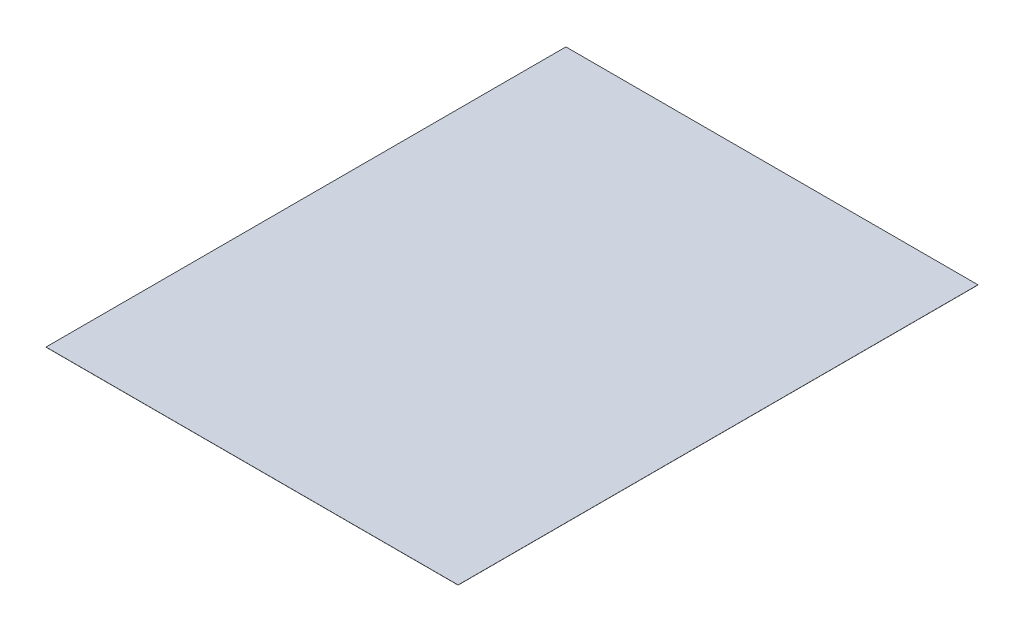
ISO-10303-21;
HEADER;
FILE_DESCRIPTION(('STEP AP214'),'2;1');
FILE_NAME('part.step','',(''),(''),'','','');
FILE_SCHEMA(('AUTOMOTIVE_DESIGN { 1 0 10303 214 1 1 1 1 }'));
ENDSEC;
DATA;
#1=APPLICATION_CONTEXT('core data for automotive mechanical design processes');
#2=APPLICATION_PROTOCOL_DEFINITION('international standard','automotive_design',2000,#1);
#3=PRODUCT_CONTEXT('',#1,'mechanical');
#4=PRODUCT('Part','Part','',(#3));
#5=PRODUCT_RELATED_PRODUCT_CATEGORY('part','',(#4));
#6=PRODUCT_DEFINITION_FORMATION('','',#4);
#7=PRODUCT_DEFINITION_CONTEXT('part definition',#1,'design');
#8=PRODUCT_DEFINITION('design','',#6,#7);
#9=PRODUCT_DEFINITION_SHAPE('','',#8);
#10=(LENGTH_UNIT() NAMED_UNIT(*) SI_UNIT(.MILLI.,.METRE.));
#11=(NAMED_UNIT(*) PLANE_ANGLE_UNIT() SI_UNIT($,.RADIAN.));
#12=(NAMED_UNIT(*) SI_UNIT($,.STERADIAN.) SOLID_ANGLE_UNIT());
#13=UNCERTAINTY_MEASURE_WITH_UNIT(LENGTH_MEASURE(1.E-05),#10,'distance_accuracy_value','');
#14=(GEOMETRIC_REPRESENTATION_CONTEXT(3) GLOBAL_UNCERTAINTY_ASSIGNED_CONTEXT((#13)) GLOBAL_UNIT_ASSIGNED_CONTEXT((#10,
#11,#12)) REPRESENTATION_CONTEXT('',''));
#15=CARTESIAN_POINT('',(0.,0.,0.));
#16=DIRECTION('',(0.,0.,1.));
#17=DIRECTION('',(1.,0.,0.));
#18=AXIS2_PLACEMENT_3D('',#15,#16,#17);
#19=CARTESIAN_POINT('',(0.,0.02,0.));
#20=DIRECTION('',(0.,1.,0.));
#21=DIRECTION('',(0.,0.,1.));
#22=AXIS2_PLACEMENT_3D('',#19,#20,#21);
#23=PLANE('',#22);
#24=DIRECTION('',(-1.,0.,0.));
#25=VECTOR('',#24,1.);
#26=CARTESIAN_POINT('',(32.5,0.02,-41.));
#27=LINE('',#26,#25);
#28=CARTESIAN_POINT('',(-32.5,0.02,-41.));
#29=VERTEX_POINT('',#28);
#30=CARTESIAN_POINT('',(32.5,0.02,-41.));
#31=VERTEX_POINT('',#30);
#32=EDGE_CURVE('E68',#29,#31,#27,.F.);
#33=ORIENTED_EDGE('',*,*,#32,.F.);
#34=DIRECTION('',(0.,0.,1.));
#35=VECTOR('',#34,1.);
#36=CARTESIAN_POINT('',(-32.5,0.02,-41.));
#37=LINE('',#36,#35);
#38=CARTESIAN_POINT('',(-32.5,0.02,41.));
#39=VERTEX_POINT('',#38);
#40=EDGE_CURVE('E20',#39,#29,#37,.F.);
#41=ORIENTED_EDGE('',*,*,#40,.F.);
#42=DIRECTION('',(1.,0.,0.));
#43=VECTOR('',#42,1.);
#44=CARTESIAN_POINT('',(-32.5,0.02,41.));
#45=LINE('',#44,#43);
#46=CARTESIAN_POINT('',(32.5,0.02,41.));
#47=VERTEX_POINT('',#46);
#48=EDGE_CURVE('E58',#47,#39,#45,.F.);
#49=ORIENTED_EDGE('',*,*,#48,.F.);
#50=DIRECTION('',(0.,0.,-1.));
#51=VECTOR('',#50,1.);
#52=CARTESIAN_POINT('',(32.5,0.02,41.));
#53=LINE('',#52,#51);
#54=EDGE_CURVE('E53',#31,#47,#53,.F.);
#55=ORIENTED_EDGE('',*,*,#54,.F.);
#56=EDGE_LOOP('',(#33,#41,#49,#55));
#57=FACE_BOUND('',#56,.T.);
#58=ADVANCED_FACE('F17',(#57),#23,.T.);
#59=CARTESIAN_POINT('',(-32.5,0.,-41.));
#60=DIRECTION('',(-1.,0.,0.));
#61=DIRECTION('',(0.,0.,1.));
#62=AXIS2_PLACEMENT_3D('',#59,#60,#61);
#63=PLANE('',#62);
#64=DIRECTION('',(0.,1.,0.));
#65=VECTOR('',#64,1.);
#66=CARTESIAN_POINT('',(-32.5,0.,-41.));
#67=LINE('',#66,#65);
#68=CARTESIAN_POINT('',(-32.5,0.,-41.));
#69=VERTEX_POINT('',#68);
#70=EDGE_CURVE('E79',#69,#29,#67,.T.);
#71=ORIENTED_EDGE('',*,*,#70,.F.);
#72=DIRECTION('',(0.,0.,1.));
#73=VECTOR('',#72,1.);
#74=CARTESIAN_POINT('',(-32.5,0.,0.));
#75=LINE('',#74,#73);
#76=CARTESIAN_POINT('',(-32.5,0.,41.));
#77=VERTEX_POINT('',#76);
#78=EDGE_CURVE('E74',#69,#77,#75,.T.);
#79=ORIENTED_EDGE('',*,*,#78,.T.);
#80=DIRECTION('',(0.,1.,0.));
#81=VECTOR('',#80,1.);
#82=CARTESIAN_POINT('',(-32.5,0.,41.));
#83=LINE('',#82,#81);
#84=EDGE_CURVE('E63',#39,#77,#83,.F.);
#85=ORIENTED_EDGE('',*,*,#84,.F.);
#86=ORIENTED_EDGE('',*,*,#40,.T.);
#87=EDGE_LOOP('',(#71,#79,#85,#86));
#88=FACE_BOUND('',#87,.T.);
#89=ADVANCED_FACE('F73',(#88),#63,.T.);
#90=CARTESIAN_POINT('',(-32.5,0.,41.));
#91=DIRECTION('',(0.,0.,1.));
#92=DIRECTION('',(1.,0.,0.));
#93=AXIS2_PLACEMENT_3D('',#90,#91,#92);
#94=PLANE('',#93);
#95=ORIENTED_EDGE('',*,*,#84,.T.);
#96=DIRECTION('',(1.,0.,0.));
#97=VECTOR('',#96,1.);
#98=CARTESIAN_POINT('',(0.,0.,41.));
#99=LINE('',#98,#97);
#100=CARTESIAN_POINT('',(32.5,0.,41.));
#101=VERTEX_POINT('',#100);
#102=EDGE_CURVE('E84',#77,#101,#99,.T.);
#103=ORIENTED_EDGE('',*,*,#102,.T.);
#104=DIRECTION('',(0.,1.,0.));
#105=VECTOR('',#104,1.);
#106=CARTESIAN_POINT('',(32.5,0.,41.));
#107=LINE('',#106,#105);
#108=EDGE_CURVE('E65',#47,#101,#107,.F.);
#109=ORIENTED_EDGE('',*,*,#108,.F.);
#110=ORIENTED_EDGE('',*,*,#48,.T.);
#111=EDGE_LOOP('',(#95,#103,#109,#110));
#112=FACE_BOUND('',#111,.T.);
#113=ADVANCED_FACE('F60',(#112),#94,.T.);
#114=CARTESIAN_POINT('',(32.5,0.,41.));
#115=DIRECTION('',(1.,0.,0.));
#116=DIRECTION('',(0.,0.,-1.));
#117=AXIS2_PLACEMENT_3D('',#114,#115,#116);
#118=PLANE('',#117);
#119=ORIENTED_EDGE('',*,*,#108,.T.);
#120=DIRECTION('',(0.,0.,1.));
#121=VECTOR('',#120,1.);
#122=CARTESIAN_POINT('',(32.5,0.,0.));
#123=LINE('',#122,#121);
#124=CARTESIAN_POINT('',(32.5,0.,-41.));
#125=VERTEX_POINT('',#124);
#126=EDGE_CURVE('E26',#101,#125,#123,.F.);
#127=ORIENTED_EDGE('',*,*,#126,.T.);
#128=DIRECTION('',(0.,1.,0.));
#129=VECTOR('',#128,1.);
#130=CARTESIAN_POINT('',(32.5,0.,-41.));
#131=LINE('',#130,#129);
#132=EDGE_CURVE('E34',#31,#125,#131,.F.);
#133=ORIENTED_EDGE('',*,*,#132,.F.);
#134=ORIENTED_EDGE('',*,*,#54,.T.);
#135=EDGE_LOOP('',(#119,#127,#133,#134));
#136=FACE_BOUND('',#135,.T.);
#137=ADVANCED_FACE('F88',(#136),#118,.T.);
#138=CARTESIAN_POINT('',(32.5,0.,-41.));
#139=DIRECTION('',(0.,0.,-1.));
#140=DIRECTION('',(-1.,0.,0.));
#141=AXIS2_PLACEMENT_3D('',#138,#139,#140);
#142=PLANE('',#141);
#143=ORIENTED_EDGE('',*,*,#132,.T.);
#144=DIRECTION('',(1.,0.,0.));
#145=VECTOR('',#144,1.);
#146=CARTESIAN_POINT('',(0.,0.,-41.));
#147=LINE('',#146,#145);
#148=EDGE_CURVE('E11',#125,#69,#147,.F.);
#149=ORIENTED_EDGE('',*,*,#148,.T.);
#150=ORIENTED_EDGE('',*,*,#70,.T.);
#151=ORIENTED_EDGE('',*,*,#32,.T.);
#152=EDGE_LOOP('',(#143,#149,#150,#151));
#153=FACE_BOUND('',#152,.T.);
#154=ADVANCED_FACE('F91',(#153),#142,.T.);
#155=CARTESIAN_POINT('',(0.,0.,0.));
#156=DIRECTION('',(0.,1.,0.));
#157=DIRECTION('',(0.,0.,1.));
#158=AXIS2_PLACEMENT_3D('',#155,#156,#157);
#159=PLANE('',#158);
#160=ORIENTED_EDGE('',*,*,#126,.F.);
#161=ORIENTED_EDGE('',*,*,#102,.F.);
#162=ORIENTED_EDGE('',*,*,#78,.F.);
#163=ORIENTED_EDGE('',*,*,#148,.F.);
#164=EDGE_LOOP('',(#160,#161,#162,#163));
#165=FACE_BOUND('',#164,.T.);
#166=ADVANCED_FACE('F90',(#165),#159,.F.);
#167=CLOSED_SHELL('',(#58,#89,#113,#137,#154,#166));
#168=MANIFOLD_SOLID_BREP('B1',#167);
#169=ADVANCED_BREP_SHAPE_REPRESENTATION('',(#18,#168),#14);
#170=SHAPE_DEFINITION_REPRESENTATION(#9,#169);
ENDSEC;
END-ISO-10303-21;
